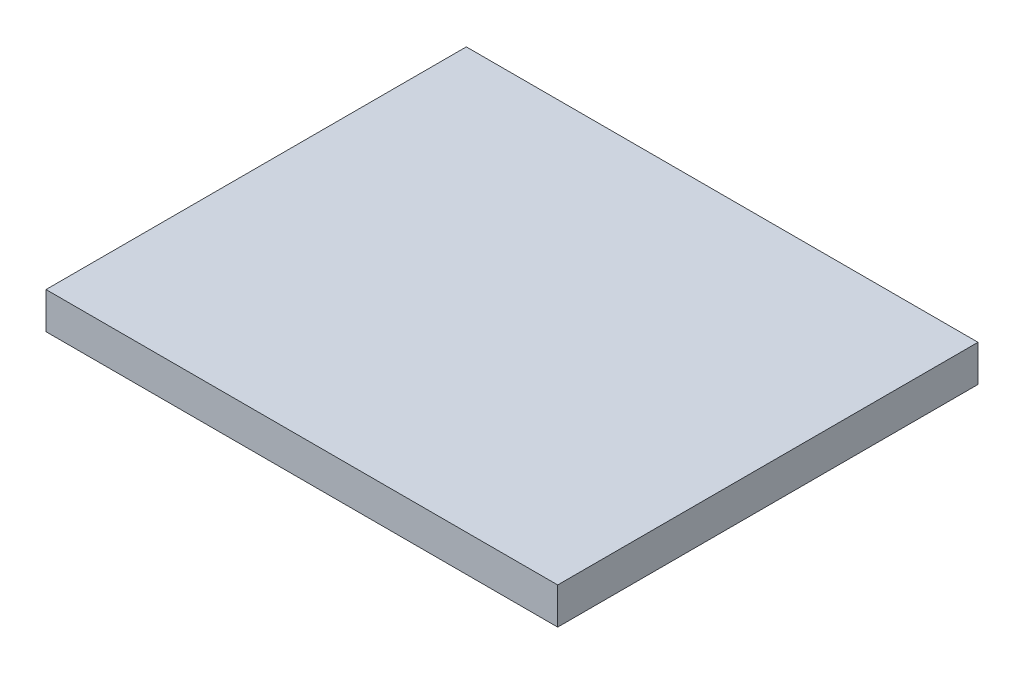
ISO-10303-21;
HEADER;
FILE_DESCRIPTION(('STEP AP214'),'2;1');
FILE_NAME('part.step','',(''),(''),'','','');
FILE_SCHEMA(('AUTOMOTIVE_DESIGN { 1 0 10303 214 1 1 1 1 }'));
ENDSEC;
DATA;
#1=APPLICATION_CONTEXT('core data for automotive mechanical design processes');
#2=APPLICATION_PROTOCOL_DEFINITION('international standard','automotive_design',2000,#1);
#3=PRODUCT_CONTEXT('',#1,'mechanical');
#4=PRODUCT('Part','Part','',(#3));
#5=PRODUCT_RELATED_PRODUCT_CATEGORY('part','',(#4));
#6=PRODUCT_DEFINITION_FORMATION('','',#4);
#7=PRODUCT_DEFINITION_CONTEXT('part definition',#1,'design');
#8=PRODUCT_DEFINITION('design','',#6,#7);
#9=PRODUCT_DEFINITION_SHAPE('','',#8);
#10=(LENGTH_UNIT() NAMED_UNIT(*) SI_UNIT(.MILLI.,.METRE.));
#11=(NAMED_UNIT(*) PLANE_ANGLE_UNIT() SI_UNIT($,.RADIAN.));
#12=(NAMED_UNIT(*) SI_UNIT($,.STERADIAN.) SOLID_ANGLE_UNIT());
#13=UNCERTAINTY_MEASURE_WITH_UNIT(LENGTH_MEASURE(1.E-05),#10,'distance_accuracy_value','');
#14=(GEOMETRIC_REPRESENTATION_CONTEXT(3) GLOBAL_UNCERTAINTY_ASSIGNED_CONTEXT((#13)) GLOBAL_UNIT_ASSIGNED_CONTEXT((#10,
#11,#12)) REPRESENTATION_CONTEXT('',''));
#15=CARTESIAN_POINT('',(0.,0.,0.));
#16=DIRECTION('',(0.,0.,1.));
#17=DIRECTION('',(1.,0.,0.));
#18=AXIS2_PLACEMENT_3D('',#15,#16,#17);
#19=CARTESIAN_POINT('',(-70.,10.,57.5));
#20=DIRECTION('',(1.,0.,0.));
#21=DIRECTION('',(0.,0.,-1.));
#22=AXIS2_PLACEMENT_3D('',#19,#20,#21);
#23=PLANE('',#22);
#24=DIRECTION('',(0.,0.,1.));
#25=VECTOR('',#24,1.);
#26=CARTESIAN_POINT('',(-70.,0.,57.5));
#27=LINE('',#26,#25);
#28=CARTESIAN_POINT('',(-70.,0.,-57.5));
#29=VERTEX_POINT('',#28);
#30=CARTESIAN_POINT('',(-70.,0.,57.5));
#31=VERTEX_POINT('',#30);
#32=EDGE_CURVE('E115',#29,#31,#27,.T.);
#33=ORIENTED_EDGE('',*,*,#32,.T.);
#34=DIRECTION('',(0.,-1.,0.));
#35=VECTOR('',#34,1.);
#36=CARTESIAN_POINT('',(-70.,10.,57.5));
#37=LINE('',#36,#35);
#38=CARTESIAN_POINT('',(-70.,10.,57.5));
#39=VERTEX_POINT('',#38);
#40=EDGE_CURVE('E11',#39,#31,#37,.T.);
#41=ORIENTED_EDGE('',*,*,#40,.F.);
#42=DIRECTION('',(0.,0.,1.));
#43=VECTOR('',#42,1.);
#44=CARTESIAN_POINT('',(-70.,10.,57.5));
#45=LINE('',#44,#43);
#46=CARTESIAN_POINT('',(-70.,10.,-57.5));
#47=VERTEX_POINT('',#46);
#48=EDGE_CURVE('E92',#47,#39,#45,.T.);
#49=ORIENTED_EDGE('',*,*,#48,.F.);
#50=DIRECTION('',(0.,-1.,0.));
#51=VECTOR('',#50,1.);
#52=CARTESIAN_POINT('',(-70.,10.,-57.5));
#53=LINE('',#52,#51);
#54=EDGE_CURVE('E107',#47,#29,#53,.T.);
#55=ORIENTED_EDGE('',*,*,#54,.T.);
#56=EDGE_LOOP('',(#33,#41,#49,#55));
#57=FACE_BOUND('',#56,.T.);
#58=ADVANCED_FACE('F43',(#57),#23,.F.);
#59=CARTESIAN_POINT('',(-70.,10.,57.5));
#60=DIRECTION('',(0.,0.,-1.));
#61=DIRECTION('',(-1.,0.,0.));
#62=AXIS2_PLACEMENT_3D('',#59,#60,#61);
#63=PLANE('',#62);
#64=DIRECTION('',(1.,0.,0.));
#65=VECTOR('',#64,1.);
#66=CARTESIAN_POINT('',(-70.,0.,57.5));
#67=LINE('',#66,#65);
#68=CARTESIAN_POINT('',(70.,0.,57.5));
#69=VERTEX_POINT('',#68);
#70=EDGE_CURVE('E99',#31,#69,#67,.T.);
#71=ORIENTED_EDGE('',*,*,#70,.T.);
#72=DIRECTION('',(0.,-1.,0.));
#73=VECTOR('',#72,1.);
#74=CARTESIAN_POINT('',(70.,10.,57.5));
#75=LINE('',#74,#73);
#76=CARTESIAN_POINT('',(70.,10.,57.5));
#77=VERTEX_POINT('',#76);
#78=EDGE_CURVE('E55',#77,#69,#75,.T.);
#79=ORIENTED_EDGE('',*,*,#78,.F.);
#80=DIRECTION('',(1.,0.,0.));
#81=VECTOR('',#80,1.);
#82=CARTESIAN_POINT('',(-70.,10.,57.5));
#83=LINE('',#82,#81);
#84=EDGE_CURVE('E89',#39,#77,#83,.T.);
#85=ORIENTED_EDGE('',*,*,#84,.F.);
#86=ORIENTED_EDGE('',*,*,#40,.T.);
#87=EDGE_LOOP('',(#71,#79,#85,#86));
#88=FACE_BOUND('',#87,.T.);
#89=ADVANCED_FACE('F97',(#88),#63,.F.);
#90=CARTESIAN_POINT('',(70.,10.,57.5));
#91=DIRECTION('',(-1.,0.,0.));
#92=DIRECTION('',(0.,0.,1.));
#93=AXIS2_PLACEMENT_3D('',#90,#91,#92);
#94=PLANE('',#93);
#95=DIRECTION('',(0.,0.,-1.));
#96=VECTOR('',#95,1.);
#97=CARTESIAN_POINT('',(70.,0.,57.5));
#98=LINE('',#97,#96);
#99=CARTESIAN_POINT('',(70.,0.,-57.5));
#100=VERTEX_POINT('',#99);
#101=EDGE_CURVE('E76',#69,#100,#98,.T.);
#102=ORIENTED_EDGE('',*,*,#101,.T.);
#103=DIRECTION('',(0.,-1.,0.));
#104=VECTOR('',#103,1.);
#105=CARTESIAN_POINT('',(70.,10.,-57.5));
#106=LINE('',#105,#104);
#107=CARTESIAN_POINT('',(70.,10.,-57.5));
#108=VERTEX_POINT('',#107);
#109=EDGE_CURVE('E105',#108,#100,#106,.T.);
#110=ORIENTED_EDGE('',*,*,#109,.F.);
#111=DIRECTION('',(0.,0.,-1.));
#112=VECTOR('',#111,1.);
#113=CARTESIAN_POINT('',(70.,10.,57.5));
#114=LINE('',#113,#112);
#115=EDGE_CURVE('E91',#77,#108,#114,.T.);
#116=ORIENTED_EDGE('',*,*,#115,.F.);
#117=ORIENTED_EDGE('',*,*,#78,.T.);
#118=EDGE_LOOP('',(#102,#110,#116,#117));
#119=FACE_BOUND('',#118,.T.);
#120=ADVANCED_FACE('F103',(#119),#94,.F.);
#121=CARTESIAN_POINT('',(-70.,10.,-57.5));
#122=DIRECTION('',(0.,0.,1.));
#123=DIRECTION('',(1.,0.,0.));
#124=AXIS2_PLACEMENT_3D('',#121,#122,#123);
#125=PLANE('',#124);
#126=DIRECTION('',(-1.,0.,0.));
#127=VECTOR('',#126,1.);
#128=CARTESIAN_POINT('',(-70.,0.,-57.5));
#129=LINE('',#128,#127);
#130=EDGE_CURVE('E82',#100,#29,#129,.T.);
#131=ORIENTED_EDGE('',*,*,#130,.T.);
#132=ORIENTED_EDGE('',*,*,#54,.F.);
#133=DIRECTION('',(-1.,0.,0.));
#134=VECTOR('',#133,1.);
#135=CARTESIAN_POINT('',(-70.,10.,-57.5));
#136=LINE('',#135,#134);
#137=EDGE_CURVE('E58',#108,#47,#136,.T.);
#138=ORIENTED_EDGE('',*,*,#137,.F.);
#139=ORIENTED_EDGE('',*,*,#109,.T.);
#140=EDGE_LOOP('',(#131,#132,#138,#139));
#141=FACE_BOUND('',#140,.T.);
#142=ADVANCED_FACE('F123',(#141),#125,.F.);
#143=CARTESIAN_POINT('',(0.,10.,0.));
#144=DIRECTION('',(0.,-1.,0.));
#145=DIRECTION('',(0.,0.,-1.));
#146=AXIS2_PLACEMENT_3D('',#143,#144,#145);
#147=PLANE('',#146);
#148=ORIENTED_EDGE('',*,*,#48,.T.);
#149=ORIENTED_EDGE('',*,*,#84,.T.);
#150=ORIENTED_EDGE('',*,*,#115,.T.);
#151=ORIENTED_EDGE('',*,*,#137,.T.);
#152=EDGE_LOOP('',(#148,#149,#150,#151));
#153=FACE_BOUND('',#152,.T.);
#154=ADVANCED_FACE('F93',(#153),#147,.F.);
#155=CARTESIAN_POINT('',(0.,0.,0.));
#156=DIRECTION('',(0.,-1.,0.));
#157=DIRECTION('',(0.,0.,-1.));
#158=AXIS2_PLACEMENT_3D('',#155,#156,#157);
#159=PLANE('',#158);
#160=ORIENTED_EDGE('',*,*,#32,.F.);
#161=ORIENTED_EDGE('',*,*,#130,.F.);
#162=ORIENTED_EDGE('',*,*,#101,.F.);
#163=ORIENTED_EDGE('',*,*,#70,.F.);
#164=EDGE_LOOP('',(#160,#161,#162,#163));
#165=FACE_BOUND('',#164,.T.);
#166=ADVANCED_FACE('F130',(#165),#159,.T.);
#167=CLOSED_SHELL('',(#58,#89,#120,#142,#154,#166));
#168=MANIFOLD_SOLID_BREP('B2',#167);
#169=ADVANCED_BREP_SHAPE_REPRESENTATION('',(#18,#168),#14);
#170=SHAPE_DEFINITION_REPRESENTATION(#9,#169);
ENDSEC;
END-ISO-10303-21;
